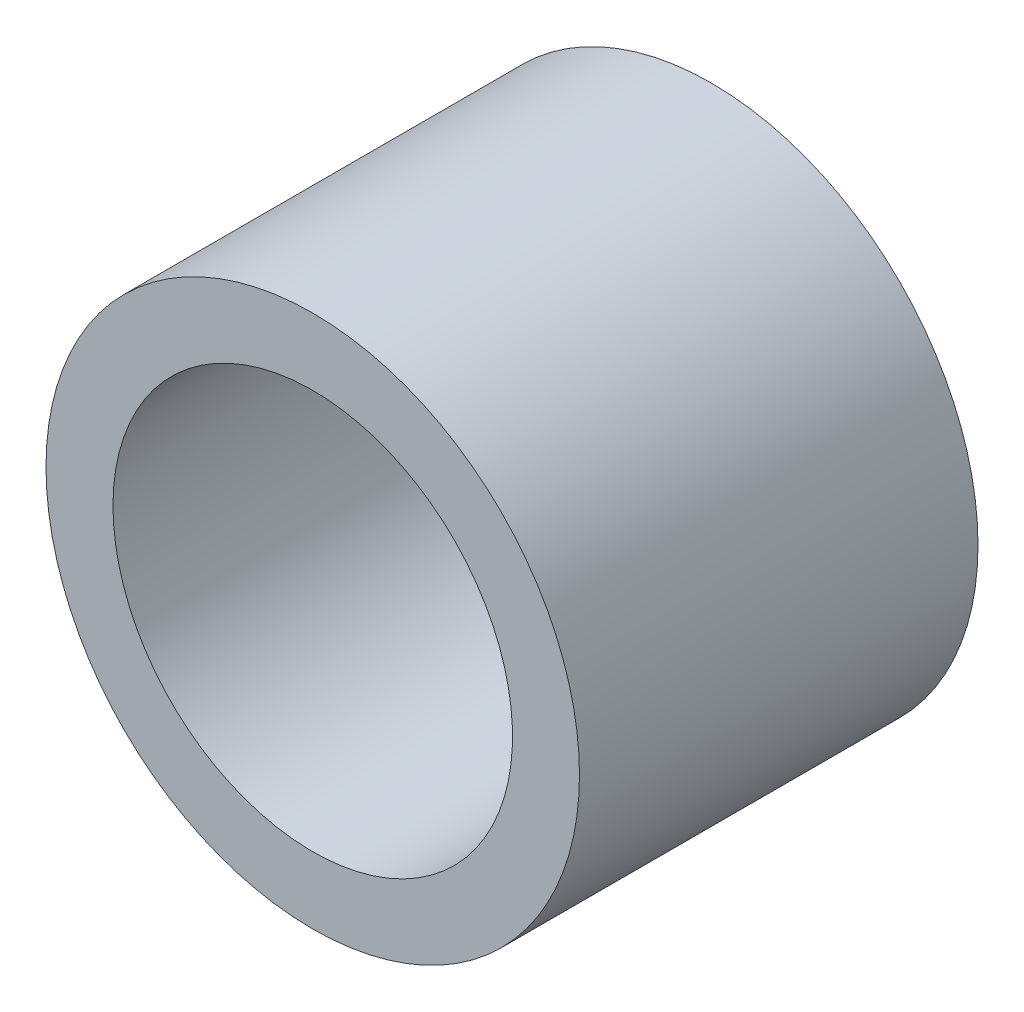
ISO-10303-21;
HEADER;
FILE_DESCRIPTION(('STEP AP214'),'2;1');
FILE_NAME('part.step','',(''),(''),'','','');
FILE_SCHEMA(('AUTOMOTIVE_DESIGN { 1 0 10303 214 1 1 1 1 }'));
ENDSEC;
DATA;
#1=APPLICATION_CONTEXT('core data for automotive mechanical design processes');
#2=APPLICATION_PROTOCOL_DEFINITION('international standard','automotive_design',2000,#1);
#3=PRODUCT_CONTEXT('',#1,'mechanical');
#4=PRODUCT('Part','Part','',(#3));
#5=PRODUCT_RELATED_PRODUCT_CATEGORY('part','',(#4));
#6=PRODUCT_DEFINITION_FORMATION('','',#4);
#7=PRODUCT_DEFINITION_CONTEXT('part definition',#1,'design');
#8=PRODUCT_DEFINITION('design','',#6,#7);
#9=PRODUCT_DEFINITION_SHAPE('','',#8);
#10=(LENGTH_UNIT() NAMED_UNIT(*) SI_UNIT(.MILLI.,.METRE.));
#11=(NAMED_UNIT(*) PLANE_ANGLE_UNIT() SI_UNIT($,.RADIAN.));
#12=(NAMED_UNIT(*) SI_UNIT($,.STERADIAN.) SOLID_ANGLE_UNIT());
#13=UNCERTAINTY_MEASURE_WITH_UNIT(LENGTH_MEASURE(1.E-05),#10,'distance_accuracy_value','');
#14=(GEOMETRIC_REPRESENTATION_CONTEXT(3) GLOBAL_UNCERTAINTY_ASSIGNED_CONTEXT((#13)) GLOBAL_UNIT_ASSIGNED_CONTEXT((#10,
#11,#12)) REPRESENTATION_CONTEXT('',''));
#15=CARTESIAN_POINT('',(0.,0.,0.));
#16=DIRECTION('',(0.,0.,1.));
#17=DIRECTION('',(1.,0.,0.));
#18=AXIS2_PLACEMENT_3D('',#15,#16,#17);
#19=CARTESIAN_POINT('',(0.,0.,4.7625));
#20=DIRECTION('',(0.,0.,1.));
#21=DIRECTION('',(1.,0.,0.));
#22=AXIS2_PLACEMENT_3D('',#19,#20,#21);
#23=PLANE('',#22);
#24=CARTESIAN_POINT('',(0.,0.,4.7625));
#25=DIRECTION('',(0.,0.,1.));
#26=DIRECTION('',(1.,0.,0.));
#27=AXIS2_PLACEMENT_3D('',#24,#25,#26);
#28=CIRCLE('',#27,6.3754);
#29=CARTESIAN_POINT('',(-6.3754,0.,4.7625));
#30=VERTEX_POINT('',#29);
#31=EDGE_CURVE('E10',#30,#30,#28,.T.);
#32=ORIENTED_EDGE('',*,*,#31,.T.);
#33=EDGE_LOOP('',(#32));
#34=FACE_BOUND('',#33,.T.);
#35=CARTESIAN_POINT('',(0.,0.,4.7625));
#36=DIRECTION('',(0.,0.,1.));
#37=DIRECTION('',(1.,0.,0.));
#38=AXIS2_PLACEMENT_3D('',#35,#36,#37);
#39=CIRCLE('',#38,4.7752);
#40=CARTESIAN_POINT('',(-4.7752,0.,4.7625));
#41=VERTEX_POINT('',#40);
#42=EDGE_CURVE('E41',#41,#41,#39,.T.);
#43=ORIENTED_EDGE('',*,*,#42,.F.);
#44=EDGE_LOOP('',(#43));
#45=FACE_BOUND('',#44,.T.);
#46=ADVANCED_FACE('F30',(#34,#45),#23,.T.);
#47=CARTESIAN_POINT('',(0.,0.,-4.7625));
#48=DIRECTION('',(0.,0.,1.));
#49=DIRECTION('',(1.,0.,0.));
#50=AXIS2_PLACEMENT_3D('',#47,#48,#49);
#51=PLANE('',#50);
#52=CARTESIAN_POINT('',(0.,0.,-4.7625));
#53=DIRECTION('',(0.,0.,1.));
#54=DIRECTION('',(1.,0.,0.));
#55=AXIS2_PLACEMENT_3D('',#52,#53,#54);
#56=CIRCLE('',#55,6.3754);
#57=CARTESIAN_POINT('',(-6.3754,0.,-4.7625));
#58=VERTEX_POINT('',#57);
#59=EDGE_CURVE('E34',#58,#58,#56,.T.);
#60=ORIENTED_EDGE('',*,*,#59,.F.);
#61=EDGE_LOOP('',(#60));
#62=FACE_BOUND('',#61,.T.);
#63=CARTESIAN_POINT('',(0.,0.,-4.7625));
#64=DIRECTION('',(0.,0.,1.));
#65=DIRECTION('',(1.,0.,0.));
#66=AXIS2_PLACEMENT_3D('',#63,#64,#65);
#67=CIRCLE('',#66,4.7752);
#68=CARTESIAN_POINT('',(-4.7752,0.,-4.7625));
#69=VERTEX_POINT('',#68);
#70=EDGE_CURVE('E43',#69,#69,#67,.T.);
#71=ORIENTED_EDGE('',*,*,#70,.T.);
#72=EDGE_LOOP('',(#71));
#73=FACE_BOUND('',#72,.T.);
#74=ADVANCED_FACE('F53',(#62,#73),#51,.F.);
#75=CARTESIAN_POINT('',(0.,0.,4.7625));
#76=DIRECTION('',(0.,0.,-1.));
#77=DIRECTION('',(-1.,0.,0.));
#78=AXIS2_PLACEMENT_3D('',#75,#76,#77);
#79=CYLINDRICAL_SURFACE('',#78,6.3754);
#80=CARTESIAN_POINT('',(-6.3754,0.,4.7625));
#81=CARTESIAN_POINT('',(-6.3754,0.,4.66328125));
#82=CARTESIAN_POINT('',(-6.3754,0.,4.5640625));
#83=CARTESIAN_POINT('',(-6.3754,0.,4.365625));
#84=CARTESIAN_POINT('',(-6.3754,0.,4.26640625));
#85=CARTESIAN_POINT('',(-6.3754,0.,4.06796875));
#86=CARTESIAN_POINT('',(-6.3754,0.,3.96875));
#87=CARTESIAN_POINT('',(-6.3754,0.,3.7703125));
#88=CARTESIAN_POINT('',(-6.3754,0.,3.67109375));
#89=CARTESIAN_POINT('',(-6.3754,0.,3.47265625));
#90=CARTESIAN_POINT('',(-6.3754,0.,3.3734375));
#91=CARTESIAN_POINT('',(-6.3754,0.,3.175));
#92=CARTESIAN_POINT('',(-6.3754,0.,3.07578125));
#93=CARTESIAN_POINT('',(-6.3754,0.,2.87734375));
#94=CARTESIAN_POINT('',(-6.3754,0.,2.778125));
#95=CARTESIAN_POINT('',(-6.3754,0.,2.5796875));
#96=CARTESIAN_POINT('',(-6.3754,0.,2.48046875));
#97=CARTESIAN_POINT('',(-6.3754,0.,2.28203125));
#98=CARTESIAN_POINT('',(-6.3754,0.,2.1828125));
#99=CARTESIAN_POINT('',(-6.3754,0.,1.984375));
#100=CARTESIAN_POINT('',(-6.3754,0.,1.88515625));
#101=CARTESIAN_POINT('',(-6.3754,0.,1.68671875));
#102=CARTESIAN_POINT('',(-6.3754,0.,1.5875));
#103=CARTESIAN_POINT('',(-6.3754,0.,1.3890625));
#104=CARTESIAN_POINT('',(-6.3754,0.,1.28984375));
#105=CARTESIAN_POINT('',(-6.3754,0.,1.09140625));
#106=CARTESIAN_POINT('',(-6.3754,0.,0.992187499999999));
#107=CARTESIAN_POINT('',(-6.3754,0.,0.793749999999999));
#108=CARTESIAN_POINT('',(-6.3754,0.,0.694531249999999));
#109=CARTESIAN_POINT('',(-6.3754,0.,0.496093749999999));
#110=CARTESIAN_POINT('',(-6.3754,0.,0.396874999999999));
#111=CARTESIAN_POINT('',(-6.3754,0.,0.198437499999999));
#112=CARTESIAN_POINT('',(-6.3754,0.,0.0992187499999992));
#113=CARTESIAN_POINT('',(-6.3754,0.,-0.0992187500000009));
#114=CARTESIAN_POINT('',(-6.3754,0.,-0.198437500000001));
#115=CARTESIAN_POINT('',(-6.3754,0.,-0.396875000000001));
#116=CARTESIAN_POINT('',(-6.3754,0.,-0.496093750000001));
#117=CARTESIAN_POINT('',(-6.3754,0.,-0.694531250000001));
#118=CARTESIAN_POINT('',(-6.3754,0.,-0.793750000000001));
#119=CARTESIAN_POINT('',(-6.3754,0.,-0.992187500000002));
#120=CARTESIAN_POINT('',(-6.3754,0.,-1.09140625));
#121=CARTESIAN_POINT('',(-6.3754,0.,-1.28984375));
#122=CARTESIAN_POINT('',(-6.3754,0.,-1.3890625));
#123=CARTESIAN_POINT('',(-6.3754,0.,-1.5875));
#124=CARTESIAN_POINT('',(-6.3754,0.,-1.68671875));
#125=CARTESIAN_POINT('',(-6.3754,0.,-1.88515625));
#126=CARTESIAN_POINT('',(-6.3754,0.,-1.984375));
#127=CARTESIAN_POINT('',(-6.3754,0.,-2.1828125));
#128=CARTESIAN_POINT('',(-6.3754,0.,-2.28203125));
#129=CARTESIAN_POINT('',(-6.3754,0.,-2.48046875));
#130=CARTESIAN_POINT('',(-6.3754,0.,-2.5796875));
#131=CARTESIAN_POINT('',(-6.3754,0.,-2.778125));
#132=CARTESIAN_POINT('',(-6.3754,0.,-2.87734375));
#133=CARTESIAN_POINT('',(-6.3754,0.,-3.07578125));
#134=CARTESIAN_POINT('',(-6.3754,0.,-3.175));
#135=CARTESIAN_POINT('',(-6.3754,0.,-3.3734375));
#136=CARTESIAN_POINT('',(-6.3754,0.,-3.47265625));
#137=CARTESIAN_POINT('',(-6.3754,0.,-3.67109375));
#138=CARTESIAN_POINT('',(-6.3754,0.,-3.7703125));
#139=CARTESIAN_POINT('',(-6.3754,0.,-3.96875));
#140=CARTESIAN_POINT('',(-6.3754,0.,-4.06796875));
#141=CARTESIAN_POINT('',(-6.3754,0.,-4.26640625));
#142=CARTESIAN_POINT('',(-6.3754,0.,-4.365625));
#143=CARTESIAN_POINT('',(-6.3754,0.,-4.5640625));
#144=CARTESIAN_POINT('',(-6.3754,0.,-4.66328125));
#145=CARTESIAN_POINT('',(-6.3754,0.,-4.7625));
#146=B_SPLINE_CURVE_WITH_KNOTS('',3,(#80,#81,#82,#83,#84,#85,#86,#87,#88,#89,#90,#91,#92,#93,
#94,#95,#96,#97,#98,#99,#100,#101,#102,#103,#104,#105,#106,#107,#108,#109,#110,#111,#112,#113,
#114,#115,#116,#117,#118,#119,#120,#121,#122,#123,#124,#125,#126,#127,#128,#129,#130,#131,#132,
#133,#134,#135,#136,#137,#138,#139,#140,#141,#142,#143,#144,#145),.UNSPECIFIED.,.F.,.F.,(4,2,2,
2,2,2,2,2,2,2,2,2,2,2,2,2,2,2,2,2,2,2,2,2,2,2,2,2,2,2,2,2,4),(0.,0.297656249999999,
0.595312499999999,0.89296875,1.190625,1.48828125,1.7859375,2.08359375,2.38125,2.67890625,
2.9765625,3.27421875,3.571875,3.86953125,4.1671875,4.46484375,4.7625,5.06015625,5.3578125,
5.65546875,5.953125,6.25078125,6.5484375,6.84609375,7.14375,7.44140625,7.7390625,8.03671875,
8.334375,8.63203125,8.9296875,9.22734375,9.525),.UNSPECIFIED.);
#147=EDGE_CURVE('BSEAM32',#30,#58,#146,.T.);
#148=ORIENTED_EDGE('',*,*,#31,.F.);
#149=ORIENTED_EDGE('',*,*,#59,.T.);
#150=ORIENTED_EDGE('',*,*,#147,.T.);
#151=ORIENTED_EDGE('',*,*,#147,.F.);
#152=EDGE_LOOP('',(#148,#150,#149,#151));
#153=FACE_BOUND('',#152,.T.);
#154=ADVANCED_FACE('F32',(#153),#79,.T.);
#155=CARTESIAN_POINT('',(0.,0.,4.7625));
#156=DIRECTION('',(0.,0.,-1.));
#157=DIRECTION('',(-1.,0.,0.));
#158=AXIS2_PLACEMENT_3D('',#155,#156,#157);
#159=CYLINDRICAL_SURFACE('',#158,4.7752);
#160=CARTESIAN_POINT('',(-4.7752,0.,4.7625));
#161=CARTESIAN_POINT('',(-4.7752,0.,4.66328125));
#162=CARTESIAN_POINT('',(-4.7752,0.,4.5640625));
#163=CARTESIAN_POINT('',(-4.7752,0.,4.365625));
#164=CARTESIAN_POINT('',(-4.7752,0.,4.26640625));
#165=CARTESIAN_POINT('',(-4.7752,0.,4.06796875));
#166=CARTESIAN_POINT('',(-4.7752,0.,3.96875));
#167=CARTESIAN_POINT('',(-4.7752,0.,3.7703125));
#168=CARTESIAN_POINT('',(-4.7752,0.,3.67109375));
#169=CARTESIAN_POINT('',(-4.7752,0.,3.47265625));
#170=CARTESIAN_POINT('',(-4.7752,0.,3.3734375));
#171=CARTESIAN_POINT('',(-4.7752,0.,3.175));
#172=CARTESIAN_POINT('',(-4.7752,0.,3.07578125));
#173=CARTESIAN_POINT('',(-4.7752,0.,2.87734375));
#174=CARTESIAN_POINT('',(-4.7752,0.,2.778125));
#175=CARTESIAN_POINT('',(-4.7752,0.,2.5796875));
#176=CARTESIAN_POINT('',(-4.7752,0.,2.48046875));
#177=CARTESIAN_POINT('',(-4.7752,0.,2.28203125));
#178=CARTESIAN_POINT('',(-4.7752,0.,2.1828125));
#179=CARTESIAN_POINT('',(-4.7752,0.,1.984375));
#180=CARTESIAN_POINT('',(-4.7752,0.,1.88515625));
#181=CARTESIAN_POINT('',(-4.7752,0.,1.68671875));
#182=CARTESIAN_POINT('',(-4.7752,0.,1.5875));
#183=CARTESIAN_POINT('',(-4.7752,0.,1.3890625));
#184=CARTESIAN_POINT('',(-4.7752,0.,1.28984375));
#185=CARTESIAN_POINT('',(-4.7752,0.,1.09140625));
#186=CARTESIAN_POINT('',(-4.7752,0.,0.992187499999999));
#187=CARTESIAN_POINT('',(-4.7752,0.,0.79375));
#188=CARTESIAN_POINT('',(-4.7752,0.,0.69453125));
#189=CARTESIAN_POINT('',(-4.7752,0.,0.49609375));
#190=CARTESIAN_POINT('',(-4.7752,0.,0.396875));
#191=CARTESIAN_POINT('',(-4.7752,0.,0.1984375));
#192=CARTESIAN_POINT('',(-4.7752,0.,0.0992187500000001));
#193=CARTESIAN_POINT('',(-4.7752,0.,-0.0992187500000001));
#194=CARTESIAN_POINT('',(-4.7752,0.,-0.1984375));
#195=CARTESIAN_POINT('',(-4.7752,0.,-0.396875));
#196=CARTESIAN_POINT('',(-4.7752,0.,-0.49609375));
#197=CARTESIAN_POINT('',(-4.7752,0.,-0.69453125));
#198=CARTESIAN_POINT('',(-4.7752,0.,-0.793750000000001));
#199=CARTESIAN_POINT('',(-4.7752,0.,-0.992187500000001));
#200=CARTESIAN_POINT('',(-4.7752,0.,-1.09140625));
#201=CARTESIAN_POINT('',(-4.7752,0.,-1.28984375));
#202=CARTESIAN_POINT('',(-4.7752,0.,-1.3890625));
#203=CARTESIAN_POINT('',(-4.7752,0.,-1.5875));
#204=CARTESIAN_POINT('',(-4.7752,0.,-1.68671875));
#205=CARTESIAN_POINT('',(-4.7752,0.,-1.88515625));
#206=CARTESIAN_POINT('',(-4.7752,0.,-1.984375));
#207=CARTESIAN_POINT('',(-4.7752,0.,-2.1828125));
#208=CARTESIAN_POINT('',(-4.7752,0.,-2.28203125));
#209=CARTESIAN_POINT('',(-4.7752,0.,-2.48046875));
#210=CARTESIAN_POINT('',(-4.7752,0.,-2.5796875));
#211=CARTESIAN_POINT('',(-4.7752,0.,-2.778125));
#212=CARTESIAN_POINT('',(-4.7752,0.,-2.87734375));
#213=CARTESIAN_POINT('',(-4.7752,0.,-3.07578125));
#214=CARTESIAN_POINT('',(-4.7752,0.,-3.175));
#215=CARTESIAN_POINT('',(-4.7752,0.,-3.3734375));
#216=CARTESIAN_POINT('',(-4.7752,0.,-3.47265625));
#217=CARTESIAN_POINT('',(-4.7752,0.,-3.67109375));
#218=CARTESIAN_POINT('',(-4.7752,0.,-3.7703125));
#219=CARTESIAN_POINT('',(-4.7752,0.,-3.96875));
#220=CARTESIAN_POINT('',(-4.7752,0.,-4.06796875));
#221=CARTESIAN_POINT('',(-4.7752,0.,-4.26640625));
#222=CARTESIAN_POINT('',(-4.7752,0.,-4.365625));
#223=CARTESIAN_POINT('',(-4.7752,0.,-4.5640625));
#224=CARTESIAN_POINT('',(-4.7752,0.,-4.66328125));
#225=CARTESIAN_POINT('',(-4.7752,0.,-4.7625));
#226=B_SPLINE_CURVE_WITH_KNOTS('',3,(#160,#161,#162,#163,#164,#165,#166,#167,#168,#169,#170,
#171,#172,#173,#174,#175,#176,#177,#178,#179,#180,#181,#182,#183,#184,#185,#186,#187,#188,#189,
#190,#191,#192,#193,#194,#195,#196,#197,#198,#199,#200,#201,#202,#203,#204,#205,#206,#207,#208,
#209,#210,#211,#212,#213,#214,#215,#216,#217,#218,#219,#220,#221,#222,#223,#224,#225),
.UNSPECIFIED.,.F.,.F.,(4,2,2,2,2,2,2,2,2,2,2,2,2,2,2,2,2,2,2,2,2,2,2,2,2,2,2,2,2,2,2,2,4),(0.,
0.29765625,0.5953125,0.892968750000001,1.190625,1.48828125,1.7859375,2.08359375,2.38125,
2.67890625,2.9765625,3.27421875,3.571875,3.86953125,4.1671875,4.46484375,4.7625,5.06015625,
5.3578125,5.65546875,5.953125,6.25078125,6.5484375,6.84609375,7.14375,7.44140625,7.7390625,
8.03671875,8.334375,8.63203125,8.9296875,9.22734375,9.525),.UNSPECIFIED.);
#227=EDGE_CURVE('BSEAM49',#41,#69,#226,.T.);
#228=ORIENTED_EDGE('',*,*,#42,.T.);
#229=ORIENTED_EDGE('',*,*,#70,.F.);
#230=ORIENTED_EDGE('',*,*,#227,.T.);
#231=ORIENTED_EDGE('',*,*,#227,.F.);
#232=EDGE_LOOP('',(#228,#230,#229,#231));
#233=FACE_BOUND('',#232,.T.);
#234=ADVANCED_FACE('F49',(#233),#159,.F.);
#235=CLOSED_SHELL('',(#46,#74,#154,#234));
#236=MANIFOLD_SOLID_BREP('B2',#235);
#237=ADVANCED_BREP_SHAPE_REPRESENTATION('',(#18,#236),#14);
#238=SHAPE_DEFINITION_REPRESENTATION(#9,#237);
ENDSEC;
END-ISO-10303-21;
